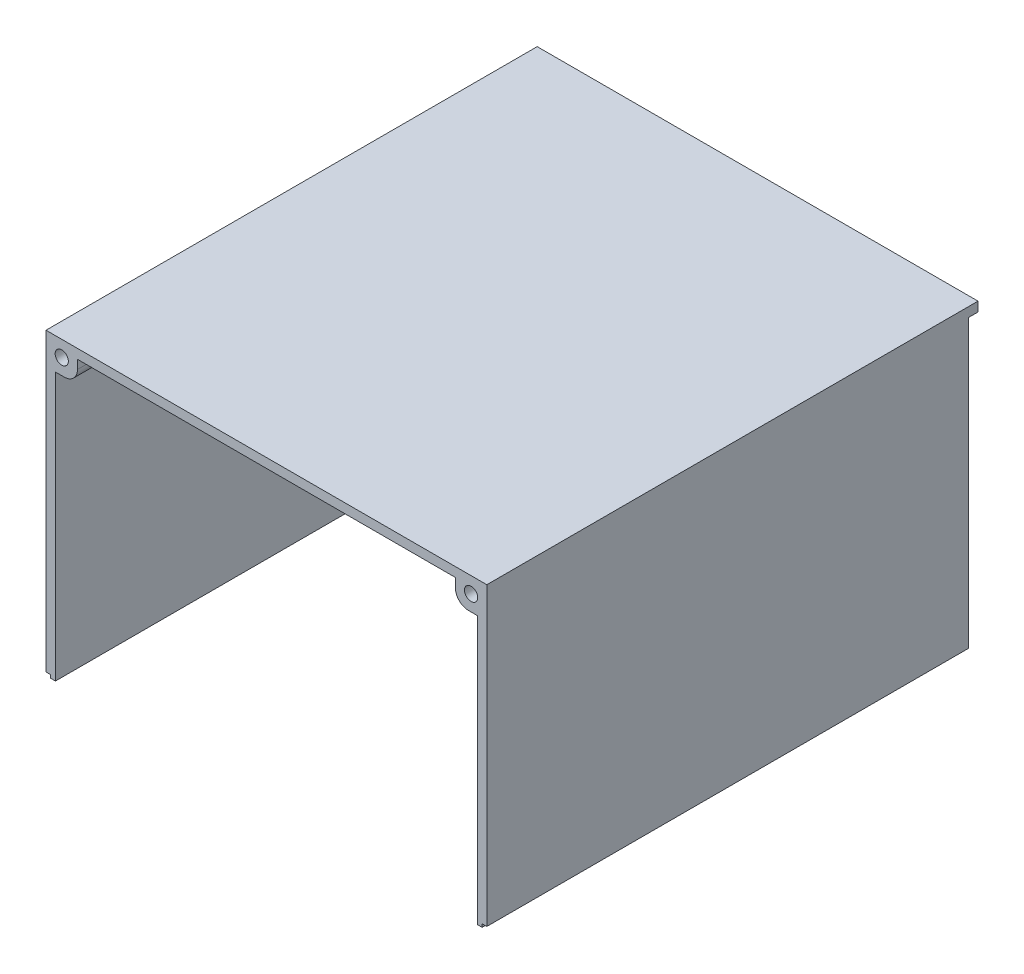
ISO-10303-21;
HEADER;
FILE_DESCRIPTION(('STEP AP214'),'2;1');
FILE_NAME('part.step','',(''),(''),'','','');
FILE_SCHEMA(('AUTOMOTIVE_DESIGN { 1 0 10303 214 1 1 1 1 }'));
ENDSEC;
DATA;
#1=APPLICATION_CONTEXT('core data for automotive mechanical design processes');
#2=APPLICATION_PROTOCOL_DEFINITION('international standard','automotive_design',2000,#1);
#3=PRODUCT_CONTEXT('',#1,'mechanical');
#4=PRODUCT('Part','Part','',(#3));
#5=PRODUCT_RELATED_PRODUCT_CATEGORY('part','',(#4));
#6=PRODUCT_DEFINITION_FORMATION('','',#4);
#7=PRODUCT_DEFINITION_CONTEXT('part definition',#1,'design');
#8=PRODUCT_DEFINITION('design','',#6,#7);
#9=PRODUCT_DEFINITION_SHAPE('','',#8);
#10=(LENGTH_UNIT() NAMED_UNIT(*) SI_UNIT(.MILLI.,.METRE.));
#11=(NAMED_UNIT(*) PLANE_ANGLE_UNIT() SI_UNIT($,.RADIAN.));
#12=(NAMED_UNIT(*) SI_UNIT($,.STERADIAN.) SOLID_ANGLE_UNIT());
#13=UNCERTAINTY_MEASURE_WITH_UNIT(LENGTH_MEASURE(1.E-05),#10,'distance_accuracy_value','');
#14=(GEOMETRIC_REPRESENTATION_CONTEXT(3) GLOBAL_UNCERTAINTY_ASSIGNED_CONTEXT((#13)) GLOBAL_UNIT_ASSIGNED_CONTEXT((#10,
#11,#12)) REPRESENTATION_CONTEXT('',''));
#15=CARTESIAN_POINT('',(0.,0.,0.));
#16=DIRECTION('',(0.,0.,1.));
#17=DIRECTION('',(1.,0.,0.));
#18=AXIS2_PLACEMENT_3D('',#15,#16,#17);
#19=CARTESIAN_POINT('',(0.,0.,0.));
#20=DIRECTION('',(0.,0.,-1.));
#21=DIRECTION('',(-1.,0.,0.));
#22=AXIS2_PLACEMENT_3D('',#19,#20,#21);
#23=PLANE('',#22);
#24=DIRECTION('',(-1.,0.,0.));
#25=VECTOR('',#24,1.);
#26=CARTESIAN_POINT('',(70.,92.,0.));
#27=LINE('',#26,#25);
#28=CARTESIAN_POINT('',(70.,92.,0.));
#29=VERTEX_POINT('',#28);
#30=CARTESIAN_POINT('',(67.0000000000001,92.,0.));
#31=VERTEX_POINT('',#30);
#32=EDGE_CURVE('E298',#29,#31,#27,.T.);
#33=ORIENTED_EDGE('',*,*,#32,.F.);
#34=DIRECTION('',(0.,1.,0.));
#35=VECTOR('',#34,1.);
#36=CARTESIAN_POINT('',(70.,1.00000000000002,0.));
#37=LINE('',#36,#35);
#38=CARTESIAN_POINT('',(70.,1.00000000000002,0.));
#39=VERTEX_POINT('',#38);
#40=EDGE_CURVE('E383',#39,#29,#37,.T.);
#41=ORIENTED_EDGE('',*,*,#40,.F.);
#42=DIRECTION('',(1.,0.,0.));
#43=VECTOR('',#42,1.);
#44=CARTESIAN_POINT('',(68.5,1.00000000000002,0.));
#45=LINE('',#44,#43);
#46=CARTESIAN_POINT('',(68.5,1.00000000000002,0.));
#47=VERTEX_POINT('',#46);
#48=EDGE_CURVE('E381',#47,#39,#45,.T.);
#49=ORIENTED_EDGE('',*,*,#48,.F.);
#50=DIRECTION('',(0.,1.,0.));
#51=VECTOR('',#50,1.);
#52=CARTESIAN_POINT('',(68.5,0.,0.));
#53=LINE('',#52,#51);
#54=CARTESIAN_POINT('',(68.5,0.,0.));
#55=VERTEX_POINT('',#54);
#56=EDGE_CURVE('E379',#55,#47,#53,.T.);
#57=ORIENTED_EDGE('',*,*,#56,.F.);
#58=DIRECTION('',(1.,0.,0.));
#59=VECTOR('',#58,1.);
#60=CARTESIAN_POINT('',(67.,0.,0.));
#61=LINE('',#60,#59);
#62=CARTESIAN_POINT('',(67.,0.,0.));
#63=VERTEX_POINT('',#62);
#64=EDGE_CURVE('E377',#63,#55,#61,.T.);
#65=ORIENTED_EDGE('',*,*,#64,.F.);
#66=DIRECTION('',(0.,-1.,0.));
#67=VECTOR('',#66,1.);
#68=CARTESIAN_POINT('',(67.0000000000001,92.,0.));
#69=LINE('',#68,#67);
#70=EDGE_CURVE('E375',#31,#63,#69,.T.);
#71=ORIENTED_EDGE('',*,*,#70,.F.);
#72=EDGE_LOOP('',(#33,#41,#49,#57,#65,#71));
#73=FACE_BOUND('',#72,.T.);
#74=ADVANCED_FACE('F35',(#73),#23,.T.);
#75=DIRECTION('',(0.,1.,0.));
#76=VECTOR('',#75,1.);
#77=CARTESIAN_POINT('',(67.0000000000001,92.,0.));
#78=LINE('',#77,#76);
#79=CARTESIAN_POINT('',(67.0000000000001,93.,0.));
#80=VERTEX_POINT('',#79);
#81=EDGE_CURVE('E291',#31,#80,#78,.T.);
#82=ORIENTED_EDGE('',*,*,#81,.F.);
#83=DIRECTION('',(1.,0.,0.));
#84=VECTOR('',#83,1.);
#85=CARTESIAN_POINT('',(67.0000000000001,92.,0.));
#86=LINE('',#85,#84);
#87=CARTESIAN_POINT('',(-67.0000000000001,92.,0.));
#88=VERTEX_POINT('',#87);
#89=EDGE_CURVE('E373',#88,#31,#86,.T.);
#90=ORIENTED_EDGE('',*,*,#89,.F.);
#91=DIRECTION('',(0.,-1.,0.));
#92=VECTOR('',#91,1.);
#93=CARTESIAN_POINT('',(-67.0000000000001,93.,0.));
#94=LINE('',#93,#92);
#95=CARTESIAN_POINT('',(-67.0000000000001,93.,0.));
#96=VERTEX_POINT('',#95);
#97=EDGE_CURVE('E310',#96,#88,#94,.T.);
#98=ORIENTED_EDGE('',*,*,#97,.F.);
#99=DIRECTION('',(-1.,0.,0.));
#100=VECTOR('',#99,1.);
#101=CARTESIAN_POINT('',(67.0000000000001,93.,0.));
#102=LINE('',#101,#100);
#103=EDGE_CURVE('E307',#80,#96,#102,.T.);
#104=ORIENTED_EDGE('',*,*,#103,.F.);
#105=EDGE_LOOP('',(#82,#90,#98,#104));
#106=FACE_BOUND('',#105,.T.);
#107=ADVANCED_FACE('F430',(#106),#23,.T.);
#108=CARTESIAN_POINT('',(-68.5,1.00000000000002,153.));
#109=DIRECTION('',(0.,1.,0.));
#110=DIRECTION('',(-1.,0.,0.));
#111=AXIS2_PLACEMENT_3D('',#108,#109,#110);
#112=PLANE('',#111);
#113=DIRECTION('',(1.,0.,0.));
#114=VECTOR('',#113,1.);
#115=CARTESIAN_POINT('',(-68.5,1.00000000000002,0.));
#116=LINE('',#115,#114);
#117=CARTESIAN_POINT('',(-70.,1.00000000000002,0.));
#118=VERTEX_POINT('',#117);
#119=CARTESIAN_POINT('',(-68.5,1.00000000000002,0.));
#120=VERTEX_POINT('',#119);
#121=EDGE_CURVE('E335',#118,#120,#116,.T.);
#122=ORIENTED_EDGE('',*,*,#121,.T.);
#123=DIRECTION('',(0.,0.,-1.));
#124=VECTOR('',#123,1.);
#125=CARTESIAN_POINT('',(-68.5,1.00000000000002,153.));
#126=LINE('',#125,#124);
#127=CARTESIAN_POINT('',(-68.5,1.00000000000002,153.));
#128=VERTEX_POINT('',#127);
#129=EDGE_CURVE('E11',#128,#120,#126,.T.);
#130=ORIENTED_EDGE('',*,*,#129,.F.);
#131=DIRECTION('',(1.,0.,0.));
#132=VECTOR('',#131,1.);
#133=CARTESIAN_POINT('',(-68.5,1.00000000000002,153.));
#134=LINE('',#133,#132);
#135=CARTESIAN_POINT('',(-70.,1.00000000000002,153.));
#136=VERTEX_POINT('',#135);
#137=EDGE_CURVE('E336',#136,#128,#134,.T.);
#138=ORIENTED_EDGE('',*,*,#137,.F.);
#139=DIRECTION('',(0.,0.,-1.));
#140=VECTOR('',#139,1.);
#141=CARTESIAN_POINT('',(-70.,1.00000000000002,153.));
#142=LINE('',#141,#140);
#143=EDGE_CURVE('E363',#136,#118,#142,.T.);
#144=ORIENTED_EDGE('',*,*,#143,.T.);
#145=EDGE_LOOP('',(#122,#130,#138,#144));
#146=FACE_BOUND('',#145,.T.);
#147=ADVANCED_FACE('F37',(#146),#112,.F.);
#148=CARTESIAN_POINT('',(-68.5,0.,153.));
#149=DIRECTION('',(1.,0.,0.));
#150=DIRECTION('',(0.,0.,-1.));
#151=AXIS2_PLACEMENT_3D('',#148,#149,#150);
#152=PLANE('',#151);
#153=DIRECTION('',(0.,-1.,0.));
#154=VECTOR('',#153,1.);
#155=CARTESIAN_POINT('',(-68.5,0.,0.));
#156=LINE('',#155,#154);
#157=CARTESIAN_POINT('',(-68.5,0.,0.));
#158=VERTEX_POINT('',#157);
#159=EDGE_CURVE('E366',#120,#158,#156,.T.);
#160=ORIENTED_EDGE('',*,*,#159,.T.);
#161=DIRECTION('',(0.,0.,-1.));
#162=VECTOR('',#161,1.);
#163=CARTESIAN_POINT('',(-68.5,0.,153.));
#164=LINE('',#163,#162);
#165=CARTESIAN_POINT('',(-68.5,0.,153.));
#166=VERTEX_POINT('',#165);
#167=EDGE_CURVE('E43',#166,#158,#164,.T.);
#168=ORIENTED_EDGE('',*,*,#167,.F.);
#169=DIRECTION('',(0.,-1.,0.));
#170=VECTOR('',#169,1.);
#171=CARTESIAN_POINT('',(-68.5,0.,153.));
#172=LINE('',#171,#170);
#173=EDGE_CURVE('E339',#128,#166,#172,.T.);
#174=ORIENTED_EDGE('',*,*,#173,.F.);
#175=ORIENTED_EDGE('',*,*,#129,.T.);
#176=EDGE_LOOP('',(#160,#168,#174,#175));
#177=FACE_BOUND('',#176,.T.);
#178=ADVANCED_FACE('F495',(#177),#152,.F.);
#179=CARTESIAN_POINT('',(-67.,0.,153.));
#180=DIRECTION('',(0.,1.,0.));
#181=DIRECTION('',(-1.,0.,0.));
#182=AXIS2_PLACEMENT_3D('',#179,#180,#181);
#183=PLANE('',#182);
#184=DIRECTION('',(1.,0.,0.));
#185=VECTOR('',#184,1.);
#186=CARTESIAN_POINT('',(-67.,0.,0.));
#187=LINE('',#186,#185);
#188=CARTESIAN_POINT('',(-67.,0.,0.));
#189=VERTEX_POINT('',#188);
#190=EDGE_CURVE('E368',#158,#189,#187,.T.);
#191=ORIENTED_EDGE('',*,*,#190,.T.);
#192=DIRECTION('',(0.,0.,-1.));
#193=VECTOR('',#192,1.);
#194=CARTESIAN_POINT('',(-67.,0.,153.));
#195=LINE('',#194,#193);
#196=CARTESIAN_POINT('',(-67.,0.,153.));
#197=VERTEX_POINT('',#196);
#198=EDGE_CURVE('E408',#197,#189,#195,.T.);
#199=ORIENTED_EDGE('',*,*,#198,.F.);
#200=DIRECTION('',(1.,0.,0.));
#201=VECTOR('',#200,1.);
#202=CARTESIAN_POINT('',(-67.,0.,153.));
#203=LINE('',#202,#201);
#204=EDGE_CURVE('E342',#166,#197,#203,.T.);
#205=ORIENTED_EDGE('',*,*,#204,.F.);
#206=ORIENTED_EDGE('',*,*,#167,.T.);
#207=EDGE_LOOP('',(#191,#199,#205,#206));
#208=FACE_BOUND('',#207,.T.);
#209=ADVANCED_FACE('F415',(#208),#183,.F.);
#210=CARTESIAN_POINT('',(-67.0000000000001,92.,153.));
#211=DIRECTION('',(-1.,0.,0.));
#212=DIRECTION('',(0.,-1.,0.));
#213=AXIS2_PLACEMENT_3D('',#210,#211,#212);
#214=PLANE('',#213);
#215=DIRECTION('',(0.,-1.,0.));
#216=VECTOR('',#215,1.);
#217=CARTESIAN_POINT('',(-67.0000000000001,92.,145.));
#218=LINE('',#217,#216);
#219=CARTESIAN_POINT('',(-67.0000000000001,92.,145.));
#220=VERTEX_POINT('',#219);
#221=CARTESIAN_POINT('',(-67.0000000000001,85.,145.));
#222=VERTEX_POINT('',#221);
#223=EDGE_CURVE('E250',#220,#222,#218,.T.);
#224=ORIENTED_EDGE('',*,*,#223,.T.);
#225=DIRECTION('',(0.,0.,1.));
#226=VECTOR('',#225,1.);
#227=CARTESIAN_POINT('',(-67.0000000000001,85.,145.));
#228=LINE('',#227,#226);
#229=CARTESIAN_POINT('',(-67.0000000000001,85.,153.));
#230=VERTEX_POINT('',#229);
#231=EDGE_CURVE('E264',#222,#230,#228,.T.);
#232=ORIENTED_EDGE('',*,*,#231,.T.);
#233=DIRECTION('',(0.,1.,0.));
#234=VECTOR('',#233,1.);
#235=CARTESIAN_POINT('',(-67.0000000000001,92.,153.));
#236=LINE('',#235,#234);
#237=EDGE_CURVE('E344',#197,#230,#236,.T.);
#238=ORIENTED_EDGE('',*,*,#237,.F.);
#239=ORIENTED_EDGE('',*,*,#198,.T.);
#240=DIRECTION('',(0.,1.,0.));
#241=VECTOR('',#240,1.);
#242=CARTESIAN_POINT('',(-67.0000000000001,92.,0.));
#243=LINE('',#242,#241);
#244=EDGE_CURVE('E370',#189,#88,#243,.T.);
#245=ORIENTED_EDGE('',*,*,#244,.T.);
#246=DIRECTION('',(0.,0.,-1.));
#247=VECTOR('',#246,1.);
#248=CARTESIAN_POINT('',(-67.0000000000001,92.,153.));
#249=LINE('',#248,#247);
#250=EDGE_CURVE('E406',#220,#88,#249,.T.);
#251=ORIENTED_EDGE('',*,*,#250,.F.);
#252=EDGE_LOOP('',(#224,#232,#238,#239,#245,#251));
#253=FACE_BOUND('',#252,.T.);
#254=ADVANCED_FACE('F426',(#253),#214,.F.);
#255=CARTESIAN_POINT('',(67.0000000000001,92.,153.));
#256=DIRECTION('',(0.,1.,0.));
#257=DIRECTION('',(0.,0.,1.));
#258=AXIS2_PLACEMENT_3D('',#255,#256,#257);
#259=PLANE('',#258);
#260=DIRECTION('',(-1.,0.,0.));
#261=VECTOR('',#260,1.);
#262=CARTESIAN_POINT('',(67.0000000000001,92.,145.));
#263=LINE('',#262,#261);
#264=CARTESIAN_POINT('',(67.0000000000001,92.,145.));
#265=VERTEX_POINT('',#264);
#266=CARTESIAN_POINT('',(60.,92.,145.));
#267=VERTEX_POINT('',#266);
#268=EDGE_CURVE('E220',#265,#267,#263,.T.);
#269=ORIENTED_EDGE('',*,*,#268,.T.);
#270=DIRECTION('',(0.,0.,1.));
#271=VECTOR('',#270,1.);
#272=CARTESIAN_POINT('',(60.,92.,145.));
#273=LINE('',#272,#271);
#274=CARTESIAN_POINT('',(60.,92.,153.));
#275=VERTEX_POINT('',#274);
#276=EDGE_CURVE('E204',#267,#275,#273,.T.);
#277=ORIENTED_EDGE('',*,*,#276,.T.);
#278=DIRECTION('',(1.,0.,0.));
#279=VECTOR('',#278,1.);
#280=CARTESIAN_POINT('',(67.0000000000001,92.,153.));
#281=LINE('',#280,#279);
#282=CARTESIAN_POINT('',(-60.,92.,153.));
#283=VERTEX_POINT('',#282);
#284=EDGE_CURVE('E347',#283,#275,#281,.T.);
#285=ORIENTED_EDGE('',*,*,#284,.F.);
#286=DIRECTION('',(0.,0.,1.));
#287=VECTOR('',#286,1.);
#288=CARTESIAN_POINT('',(-60.,92.,145.));
#289=LINE('',#288,#287);
#290=CARTESIAN_POINT('',(-60.,92.,145.));
#291=VERTEX_POINT('',#290);
#292=EDGE_CURVE('E270',#291,#283,#289,.T.);
#293=ORIENTED_EDGE('',*,*,#292,.F.);
#294=DIRECTION('',(-1.,0.,0.));
#295=VECTOR('',#294,1.);
#296=CARTESIAN_POINT('',(-67.0000000000001,92.,145.));
#297=LINE('',#296,#295);
#298=EDGE_CURVE('E261',#291,#220,#297,.T.);
#299=ORIENTED_EDGE('',*,*,#298,.T.);
#300=ORIENTED_EDGE('',*,*,#250,.T.);
#301=ORIENTED_EDGE('',*,*,#89,.T.);
#302=DIRECTION('',(0.,0.,-1.));
#303=VECTOR('',#302,1.);
#304=CARTESIAN_POINT('',(67.0000000000001,92.,153.));
#305=LINE('',#304,#303);
#306=EDGE_CURVE('E229',#265,#31,#305,.T.);
#307=ORIENTED_EDGE('',*,*,#306,.F.);
#308=EDGE_LOOP('',(#269,#277,#285,#293,#299,#300,#301,#307));
#309=FACE_BOUND('',#308,.T.);
#310=ADVANCED_FACE('F227',(#309),#259,.F.);
#311=CARTESIAN_POINT('',(67.0000000000001,92.,153.));
#312=DIRECTION('',(1.,0.,0.));
#313=DIRECTION('',(0.,1.,0.));
#314=AXIS2_PLACEMENT_3D('',#311,#312,#313);
#315=PLANE('',#314);
#316=DIRECTION('',(0.,-1.,0.));
#317=VECTOR('',#316,1.);
#318=CARTESIAN_POINT('',(67.0000000000001,92.,153.));
#319=LINE('',#318,#317);
#320=CARTESIAN_POINT('',(67.0000000000001,85.,153.));
#321=VERTEX_POINT('',#320);
#322=CARTESIAN_POINT('',(67.,0.,153.));
#323=VERTEX_POINT('',#322);
#324=EDGE_CURVE('E349',#321,#323,#319,.T.);
#325=ORIENTED_EDGE('',*,*,#324,.F.);
#326=DIRECTION('',(0.,0.,1.));
#327=VECTOR('',#326,1.);
#328=CARTESIAN_POINT('',(67.0000000000001,85.,145.));
#329=LINE('',#328,#327);
#330=CARTESIAN_POINT('',(67.0000000000001,85.,145.));
#331=VERTEX_POINT('',#330);
#332=EDGE_CURVE('E244',#331,#321,#329,.T.);
#333=ORIENTED_EDGE('',*,*,#332,.F.);
#334=DIRECTION('',(0.,1.,0.));
#335=VECTOR('',#334,1.);
#336=CARTESIAN_POINT('',(67.0000000000001,92.,145.));
#337=LINE('',#336,#335);
#338=EDGE_CURVE('E214',#331,#265,#337,.T.);
#339=ORIENTED_EDGE('',*,*,#338,.T.);
#340=ORIENTED_EDGE('',*,*,#306,.T.);
#341=ORIENTED_EDGE('',*,*,#70,.T.);
#342=DIRECTION('',(0.,0.,-1.));
#343=VECTOR('',#342,1.);
#344=CARTESIAN_POINT('',(67.,0.,153.));
#345=LINE('',#344,#343);
#346=EDGE_CURVE('E402',#323,#63,#345,.T.);
#347=ORIENTED_EDGE('',*,*,#346,.F.);
#348=EDGE_LOOP('',(#325,#333,#339,#340,#341,#347));
#349=FACE_BOUND('',#348,.T.);
#350=ADVANCED_FACE('F485',(#349),#315,.F.);
#351=CARTESIAN_POINT('',(67.,0.,153.));
#352=DIRECTION('',(0.,1.,0.));
#353=DIRECTION('',(-1.,0.,0.));
#354=AXIS2_PLACEMENT_3D('',#351,#352,#353);
#355=PLANE('',#354);
#356=ORIENTED_EDGE('',*,*,#64,.T.);
#357=DIRECTION('',(0.,0.,-1.));
#358=VECTOR('',#357,1.);
#359=CARTESIAN_POINT('',(68.5,0.,153.));
#360=LINE('',#359,#358);
#361=CARTESIAN_POINT('',(68.5,0.,153.));
#362=VERTEX_POINT('',#361);
#363=EDGE_CURVE('E399',#362,#55,#360,.T.);
#364=ORIENTED_EDGE('',*,*,#363,.F.);
#365=DIRECTION('',(1.,0.,0.));
#366=VECTOR('',#365,1.);
#367=CARTESIAN_POINT('',(67.,0.,153.));
#368=LINE('',#367,#366);
#369=EDGE_CURVE('E351',#323,#362,#368,.T.);
#370=ORIENTED_EDGE('',*,*,#369,.F.);
#371=ORIENTED_EDGE('',*,*,#346,.T.);
#372=EDGE_LOOP('',(#356,#364,#370,#371));
#373=FACE_BOUND('',#372,.T.);
#374=ADVANCED_FACE('F481',(#373),#355,.F.);
#375=CARTESIAN_POINT('',(68.5,0.,153.));
#376=DIRECTION('',(-1.,0.,0.));
#377=DIRECTION('',(0.,0.,1.));
#378=AXIS2_PLACEMENT_3D('',#375,#376,#377);
#379=PLANE('',#378);
#380=ORIENTED_EDGE('',*,*,#56,.T.);
#381=DIRECTION('',(0.,0.,-1.));
#382=VECTOR('',#381,1.);
#383=CARTESIAN_POINT('',(68.5,1.00000000000002,153.));
#384=LINE('',#383,#382);
#385=CARTESIAN_POINT('',(68.5,1.00000000000002,153.));
#386=VERTEX_POINT('',#385);
#387=EDGE_CURVE('E396',#386,#47,#384,.T.);
#388=ORIENTED_EDGE('',*,*,#387,.F.);
#389=DIRECTION('',(0.,1.,0.));
#390=VECTOR('',#389,1.);
#391=CARTESIAN_POINT('',(68.5,0.,153.));
#392=LINE('',#391,#390);
#393=EDGE_CURVE('E353',#362,#386,#392,.T.);
#394=ORIENTED_EDGE('',*,*,#393,.F.);
#395=ORIENTED_EDGE('',*,*,#363,.T.);
#396=EDGE_LOOP('',(#380,#388,#394,#395));
#397=FACE_BOUND('',#396,.T.);
#398=ADVANCED_FACE('F477',(#397),#379,.F.);
#399=CARTESIAN_POINT('',(68.5,1.00000000000002,153.));
#400=DIRECTION('',(0.,1.,0.));
#401=DIRECTION('',(-1.,0.,0.));
#402=AXIS2_PLACEMENT_3D('',#399,#400,#401);
#403=PLANE('',#402);
#404=ORIENTED_EDGE('',*,*,#48,.T.);
#405=DIRECTION('',(0.,0.,-1.));
#406=VECTOR('',#405,1.);
#407=CARTESIAN_POINT('',(70.,1.00000000000002,153.));
#408=LINE('',#407,#406);
#409=CARTESIAN_POINT('',(70.,1.00000000000002,153.));
#410=VERTEX_POINT('',#409);
#411=EDGE_CURVE('E393',#410,#39,#408,.T.);
#412=ORIENTED_EDGE('',*,*,#411,.F.);
#413=DIRECTION('',(1.,0.,0.));
#414=VECTOR('',#413,1.);
#415=CARTESIAN_POINT('',(68.5,1.00000000000002,153.));
#416=LINE('',#415,#414);
#417=EDGE_CURVE('E355',#386,#410,#416,.T.);
#418=ORIENTED_EDGE('',*,*,#417,.F.);
#419=ORIENTED_EDGE('',*,*,#387,.T.);
#420=EDGE_LOOP('',(#404,#412,#418,#419));
#421=FACE_BOUND('',#420,.T.);
#422=ADVANCED_FACE('F473',(#421),#403,.F.);
#423=CARTESIAN_POINT('',(70.,1.00000000000002,153.));
#424=DIRECTION('',(-1.,0.,0.));
#425=DIRECTION('',(0.,-1.,0.));
#426=AXIS2_PLACEMENT_3D('',#423,#424,#425);
#427=PLANE('',#426);
#428=ORIENTED_EDGE('',*,*,#40,.T.);
#429=DIRECTION('',(0.,0.,1.));
#430=VECTOR('',#429,1.);
#431=CARTESIAN_POINT('',(70.,92.,-1.5));
#432=LINE('',#431,#430);
#433=CARTESIAN_POINT('',(70.,92.,-3.));
#434=VERTEX_POINT('',#433);
#435=EDGE_CURVE('E320',#434,#29,#432,.T.);
#436=ORIENTED_EDGE('',*,*,#435,.F.);
#437=DIRECTION('',(0.,-1.,0.));
#438=VECTOR('',#437,1.);
#439=CARTESIAN_POINT('',(70.,92.,-3.));
#440=LINE('',#439,#438);
#441=CARTESIAN_POINT('',(70.,95.,-3.));
#442=VERTEX_POINT('',#441);
#443=EDGE_CURVE('E279',#442,#434,#440,.T.);
#444=ORIENTED_EDGE('',*,*,#443,.F.);
#445=DIRECTION('',(0.,0.,-1.));
#446=VECTOR('',#445,1.);
#447=CARTESIAN_POINT('',(70.,95.,153.));
#448=LINE('',#447,#446);
#449=CARTESIAN_POINT('',(70.,95.,153.));
#450=VERTEX_POINT('',#449);
#451=EDGE_CURVE('E391',#450,#442,#448,.T.);
#452=ORIENTED_EDGE('',*,*,#451,.F.);
#453=DIRECTION('',(0.,1.,0.));
#454=VECTOR('',#453,1.);
#455=CARTESIAN_POINT('',(70.,1.00000000000002,153.));
#456=LINE('',#455,#454);
#457=EDGE_CURVE('E357',#410,#450,#456,.T.);
#458=ORIENTED_EDGE('',*,*,#457,.F.);
#459=ORIENTED_EDGE('',*,*,#411,.T.);
#460=EDGE_LOOP('',(#428,#436,#444,#452,#458,#459));
#461=FACE_BOUND('',#460,.T.);
#462=ADVANCED_FACE('F469',(#461),#427,.F.);
#463=CARTESIAN_POINT('',(-70.,95.,153.));
#464=DIRECTION('',(0.,-1.,0.));
#465=DIRECTION('',(0.,0.,-1.));
#466=AXIS2_PLACEMENT_3D('',#463,#464,#465);
#467=PLANE('',#466);
#468=ORIENTED_EDGE('',*,*,#451,.T.);
#469=DIRECTION('',(1.,0.,0.));
#470=VECTOR('',#469,1.);
#471=CARTESIAN_POINT('',(70.,95.,-3.));
#472=LINE('',#471,#470);
#473=CARTESIAN_POINT('',(-70.,95.,-3.));
#474=VERTEX_POINT('',#473);
#475=EDGE_CURVE('E288',#474,#442,#472,.T.);
#476=ORIENTED_EDGE('',*,*,#475,.F.);
#477=DIRECTION('',(0.,0.,-1.));
#478=VECTOR('',#477,1.);
#479=CARTESIAN_POINT('',(-70.,95.,153.));
#480=LINE('',#479,#478);
#481=CARTESIAN_POINT('',(-70.,95.,153.));
#482=VERTEX_POINT('',#481);
#483=EDGE_CURVE('E389',#482,#474,#480,.T.);
#484=ORIENTED_EDGE('',*,*,#483,.F.);
#485=DIRECTION('',(-1.,0.,0.));
#486=VECTOR('',#485,1.);
#487=CARTESIAN_POINT('',(-70.,95.,153.));
#488=LINE('',#487,#486);
#489=EDGE_CURVE('E359',#450,#482,#488,.T.);
#490=ORIENTED_EDGE('',*,*,#489,.F.);
#491=EDGE_LOOP('',(#468,#476,#484,#490));
#492=FACE_BOUND('',#491,.T.);
#493=ADVANCED_FACE('F465',(#492),#467,.F.);
#494=CARTESIAN_POINT('',(-70.,1.00000000000002,153.));
#495=DIRECTION('',(1.,0.,0.));
#496=DIRECTION('',(0.,1.,0.));
#497=AXIS2_PLACEMENT_3D('',#494,#495,#496);
#498=PLANE('',#497);
#499=ORIENTED_EDGE('',*,*,#483,.T.);
#500=DIRECTION('',(0.,1.,0.));
#501=VECTOR('',#500,1.);
#502=CARTESIAN_POINT('',(-70.,92.,-3.));
#503=LINE('',#502,#501);
#504=CARTESIAN_POINT('',(-70.,92.,-3.));
#505=VERTEX_POINT('',#504);
#506=EDGE_CURVE('E285',#505,#474,#503,.T.);
#507=ORIENTED_EDGE('',*,*,#506,.F.);
#508=DIRECTION('',(0.,0.,1.));
#509=VECTOR('',#508,1.);
#510=CARTESIAN_POINT('',(-70.,92.,-1.5));
#511=LINE('',#510,#509);
#512=CARTESIAN_POINT('',(-70.,92.,0.));
#513=VERTEX_POINT('',#512);
#514=EDGE_CURVE('E323',#505,#513,#511,.T.);
#515=ORIENTED_EDGE('',*,*,#514,.T.);
#516=DIRECTION('',(0.,-1.,0.));
#517=VECTOR('',#516,1.);
#518=CARTESIAN_POINT('',(-70.,1.00000000000002,0.));
#519=LINE('',#518,#517);
#520=EDGE_CURVE('E340',#513,#118,#519,.T.);
#521=ORIENTED_EDGE('',*,*,#520,.T.);
#522=ORIENTED_EDGE('',*,*,#143,.F.);
#523=DIRECTION('',(0.,-1.,0.));
#524=VECTOR('',#523,1.);
#525=CARTESIAN_POINT('',(-70.,1.00000000000002,153.));
#526=LINE('',#525,#524);
#527=EDGE_CURVE('E361',#482,#136,#526,.T.);
#528=ORIENTED_EDGE('',*,*,#527,.F.);
#529=EDGE_LOOP('',(#499,#507,#515,#521,#522,#528));
#530=FACE_BOUND('',#529,.T.);
#531=ADVANCED_FACE('F462',(#530),#498,.F.);
#532=CARTESIAN_POINT('',(0.,0.,153.));
#533=DIRECTION('',(0.,0.,-1.));
#534=DIRECTION('',(-1.,0.,0.));
#535=AXIS2_PLACEMENT_3D('',#532,#533,#534);
#536=PLANE('',#535);
#537=CARTESIAN_POINT('',(-65.,90.,153.));
#538=DIRECTION('',(0.,0.,1.));
#539=DIRECTION('',(1.,0.,0.));
#540=AXIS2_PLACEMENT_3D('',#537,#538,#539);
#541=CIRCLE('',#540,2.1);
#542=CARTESIAN_POINT('',(-62.9,90.,153.));
#543=VERTEX_POINT('',#542);
#544=EDGE_CURVE('E687',#543,#543,#541,.T.);
#545=ORIENTED_EDGE('',*,*,#544,.F.);
#546=EDGE_LOOP('',(#545));
#547=FACE_BOUND('',#546,.T.);
#548=CARTESIAN_POINT('',(65.,90.,153.));
#549=DIRECTION('',(0.,0.,1.));
#550=DIRECTION('',(-1.,0.,0.));
#551=AXIS2_PLACEMENT_3D('',#548,#549,#550);
#552=CIRCLE('',#551,2.1);
#553=CARTESIAN_POINT('',(62.9,90.,153.));
#554=VERTEX_POINT('',#553);
#555=EDGE_CURVE('E234',#554,#554,#552,.T.);
#556=ORIENTED_EDGE('',*,*,#555,.F.);
#557=EDGE_LOOP('',(#556));
#558=FACE_BOUND('',#557,.T.);
#559=ORIENTED_EDGE('',*,*,#284,.T.);
#560=DIRECTION('',(0.,-1.,0.));
#561=VECTOR('',#560,1.);
#562=CARTESIAN_POINT('',(60.,92.,153.));
#563=LINE('',#562,#561);
#564=CARTESIAN_POINT('',(60.,89.2,153.));
#565=VERTEX_POINT('',#564);
#566=EDGE_CURVE('E209',#275,#565,#563,.T.);
#567=ORIENTED_EDGE('',*,*,#566,.T.);
#568=CARTESIAN_POINT('',(64.2,89.2,153.));
#569=DIRECTION('',(0.,0.,1.));
#570=DIRECTION('',(1.,0.,0.));
#571=AXIS2_PLACEMENT_3D('',#568,#569,#570);
#572=CIRCLE('',#571,4.2);
#573=CARTESIAN_POINT('',(64.2,85.,153.));
#574=VERTEX_POINT('',#573);
#575=EDGE_CURVE('E231',#565,#574,#572,.T.);
#576=ORIENTED_EDGE('',*,*,#575,.T.);
#577=DIRECTION('',(1.,0.,0.));
#578=VECTOR('',#577,1.);
#579=CARTESIAN_POINT('',(67.0000000000001,85.,153.));
#580=LINE('',#579,#578);
#581=EDGE_CURVE('E50',#574,#321,#580,.T.);
#582=ORIENTED_EDGE('',*,*,#581,.T.);
#583=ORIENTED_EDGE('',*,*,#324,.T.);
#584=ORIENTED_EDGE('',*,*,#369,.T.);
#585=ORIENTED_EDGE('',*,*,#393,.T.);
#586=ORIENTED_EDGE('',*,*,#417,.T.);
#587=ORIENTED_EDGE('',*,*,#457,.T.);
#588=ORIENTED_EDGE('',*,*,#489,.T.);
#589=ORIENTED_EDGE('',*,*,#527,.T.);
#590=ORIENTED_EDGE('',*,*,#137,.T.);
#591=ORIENTED_EDGE('',*,*,#173,.T.);
#592=ORIENTED_EDGE('',*,*,#204,.T.);
#593=ORIENTED_EDGE('',*,*,#237,.T.);
#594=DIRECTION('',(1.,0.,0.));
#595=VECTOR('',#594,1.);
#596=CARTESIAN_POINT('',(-67.0000000000001,85.,153.));
#597=LINE('',#596,#595);
#598=CARTESIAN_POINT('',(-64.2,85.,153.));
#599=VERTEX_POINT('',#598);
#600=EDGE_CURVE('E246',#230,#599,#597,.T.);
#601=ORIENTED_EDGE('',*,*,#600,.T.);
#602=CARTESIAN_POINT('',(-64.2,89.2,153.));
#603=DIRECTION('',(0.,0.,1.));
#604=DIRECTION('',(1.,0.,0.));
#605=AXIS2_PLACEMENT_3D('',#602,#603,#604);
#606=CIRCLE('',#605,4.2);
#607=CARTESIAN_POINT('',(-60.,89.2,153.));
#608=VERTEX_POINT('',#607);
#609=EDGE_CURVE('E267',#599,#608,#606,.T.);
#610=ORIENTED_EDGE('',*,*,#609,.T.);
#611=DIRECTION('',(0.,1.,0.));
#612=VECTOR('',#611,1.);
#613=CARTESIAN_POINT('',(-60.,92.,153.));
#614=LINE('',#613,#612);
#615=EDGE_CURVE('E57',#608,#283,#614,.T.);
#616=ORIENTED_EDGE('',*,*,#615,.T.);
#617=EDGE_LOOP('',(#559,#567,#576,#582,#583,#584,#585,#586,#587,#588,#589,#590,#591,#592,#593,
#601,#610,#616));
#618=FACE_BOUND('',#617,.T.);
#619=ADVANCED_FACE('F453',(#547,#558,#618),#536,.F.);
#620=DIRECTION('',(-1.,0.,0.));
#621=VECTOR('',#620,1.);
#622=CARTESIAN_POINT('',(-67.0000000000001,92.,0.));
#623=LINE('',#622,#621);
#624=EDGE_CURVE('E313',#88,#513,#623,.T.);
#625=ORIENTED_EDGE('',*,*,#624,.F.);
#626=ORIENTED_EDGE('',*,*,#244,.F.);
#627=ORIENTED_EDGE('',*,*,#190,.F.);
#628=ORIENTED_EDGE('',*,*,#159,.F.);
#629=ORIENTED_EDGE('',*,*,#121,.F.);
#630=ORIENTED_EDGE('',*,*,#520,.F.);
#631=EDGE_LOOP('',(#625,#626,#627,#628,#629,#630));
#632=FACE_BOUND('',#631,.T.);
#633=ADVANCED_FACE('F421',(#632),#23,.T.);
#634=CARTESIAN_POINT('',(67.0000000000001,92.,-1.5));
#635=DIRECTION('',(1.,0.,0.));
#636=DIRECTION('',(0.,0.,-1.));
#637=AXIS2_PLACEMENT_3D('',#634,#635,#636);
#638=PLANE('',#637);
#639=ORIENTED_EDGE('',*,*,#81,.T.);
#640=DIRECTION('',(0.,0.,1.));
#641=VECTOR('',#640,1.);
#642=CARTESIAN_POINT('',(67.0000000000001,93.,-1.5));
#643=LINE('',#642,#641);
#644=CARTESIAN_POINT('',(67.0000000000001,93.,-1.5));
#645=VERTEX_POINT('',#644);
#646=EDGE_CURVE('E332',#645,#80,#643,.T.);
#647=ORIENTED_EDGE('',*,*,#646,.F.);
#648=DIRECTION('',(0.,1.,0.));
#649=VECTOR('',#648,1.);
#650=CARTESIAN_POINT('',(67.0000000000001,92.,-1.5));
#651=LINE('',#650,#649);
#652=CARTESIAN_POINT('',(67.0000000000001,92.,-1.5));
#653=VERTEX_POINT('',#652);
#654=EDGE_CURVE('E294',#653,#645,#651,.T.);
#655=ORIENTED_EDGE('',*,*,#654,.F.);
#656=DIRECTION('',(0.,0.,1.));
#657=VECTOR('',#656,1.);
#658=CARTESIAN_POINT('',(67.0000000000001,92.,-1.5));
#659=LINE('',#658,#657);
#660=EDGE_CURVE('E304',#653,#31,#659,.T.);
#661=ORIENTED_EDGE('',*,*,#660,.T.);
#662=EDGE_LOOP('',(#639,#647,#655,#661));
#663=FACE_BOUND('',#662,.T.);
#664=ADVANCED_FACE('F445',(#663),#638,.F.);
#665=CARTESIAN_POINT('',(67.0000000000001,93.,-1.5));
#666=DIRECTION('',(0.,1.,0.));
#667=DIRECTION('',(0.,0.,1.));
#668=AXIS2_PLACEMENT_3D('',#665,#666,#667);
#669=PLANE('',#668);
#670=ORIENTED_EDGE('',*,*,#103,.T.);
#671=DIRECTION('',(0.,0.,1.));
#672=VECTOR('',#671,1.);
#673=CARTESIAN_POINT('',(-67.0000000000001,93.,-1.5));
#674=LINE('',#673,#672);
#675=CARTESIAN_POINT('',(-67.0000000000001,93.,-1.5));
#676=VERTEX_POINT('',#675);
#677=EDGE_CURVE('E329',#676,#96,#674,.T.);
#678=ORIENTED_EDGE('',*,*,#677,.F.);
#679=DIRECTION('',(-1.,0.,0.));
#680=VECTOR('',#679,1.);
#681=CARTESIAN_POINT('',(67.0000000000001,93.,-1.5));
#682=LINE('',#681,#680);
#683=EDGE_CURVE('E297',#645,#676,#682,.T.);
#684=ORIENTED_EDGE('',*,*,#683,.F.);
#685=ORIENTED_EDGE('',*,*,#646,.T.);
#686=EDGE_LOOP('',(#670,#678,#684,#685));
#687=FACE_BOUND('',#686,.T.);
#688=ADVANCED_FACE('F443',(#687),#669,.F.);
#689=CARTESIAN_POINT('',(-67.0000000000001,93.,-1.5));
#690=DIRECTION('',(-1.,0.,0.));
#691=DIRECTION('',(0.,0.,1.));
#692=AXIS2_PLACEMENT_3D('',#689,#690,#691);
#693=PLANE('',#692);
#694=ORIENTED_EDGE('',*,*,#97,.T.);
#695=DIRECTION('',(0.,0.,1.));
#696=VECTOR('',#695,1.);
#697=CARTESIAN_POINT('',(-67.0000000000001,92.,-1.5));
#698=LINE('',#697,#696);
#699=CARTESIAN_POINT('',(-67.0000000000001,92.,-1.5));
#700=VERTEX_POINT('',#699);
#701=EDGE_CURVE('E326',#700,#88,#698,.T.);
#702=ORIENTED_EDGE('',*,*,#701,.F.);
#703=DIRECTION('',(0.,-1.,0.));
#704=VECTOR('',#703,1.);
#705=CARTESIAN_POINT('',(-67.0000000000001,93.,-1.5));
#706=LINE('',#705,#704);
#707=EDGE_CURVE('E301',#676,#700,#706,.T.);
#708=ORIENTED_EDGE('',*,*,#707,.F.);
#709=ORIENTED_EDGE('',*,*,#677,.T.);
#710=EDGE_LOOP('',(#694,#702,#708,#709));
#711=FACE_BOUND('',#710,.T.);
#712=ADVANCED_FACE('F433',(#711),#693,.F.);
#713=CARTESIAN_POINT('',(-67.0000000000001,92.,-1.5));
#714=DIRECTION('',(0.,1.,0.));
#715=DIRECTION('',(0.,0.,1.));
#716=AXIS2_PLACEMENT_3D('',#713,#714,#715);
#717=PLANE('',#716);
#718=ORIENTED_EDGE('',*,*,#624,.T.);
#719=ORIENTED_EDGE('',*,*,#514,.F.);
#720=DIRECTION('',(-1.,0.,0.));
#721=VECTOR('',#720,1.);
#722=CARTESIAN_POINT('',(70.,92.,-3.));
#723=LINE('',#722,#721);
#724=EDGE_CURVE('E282',#434,#505,#723,.T.);
#725=ORIENTED_EDGE('',*,*,#724,.F.);
#726=ORIENTED_EDGE('',*,*,#435,.T.);
#727=ORIENTED_EDGE('',*,*,#32,.T.);
#728=ORIENTED_EDGE('',*,*,#660,.F.);
#729=DIRECTION('',(-1.,0.,0.));
#730=VECTOR('',#729,1.);
#731=CARTESIAN_POINT('',(70.,92.,-1.5));
#732=LINE('',#731,#730);
#733=EDGE_CURVE('E272',#653,#700,#732,.T.);
#734=ORIENTED_EDGE('',*,*,#733,.T.);
#735=ORIENTED_EDGE('',*,*,#701,.T.);
#736=EDGE_LOOP('',(#718,#719,#725,#726,#727,#728,#734,#735));
#737=FACE_BOUND('',#736,.T.);
#738=ADVANCED_FACE('F436',(#737),#717,.F.);
#739=CARTESIAN_POINT('',(0.,0.,-3.));
#740=DIRECTION('',(0.,0.,1.));
#741=DIRECTION('',(1.,0.,0.));
#742=AXIS2_PLACEMENT_3D('',#739,#740,#741);
#743=PLANE('',#742);
#744=ORIENTED_EDGE('',*,*,#443,.T.);
#745=ORIENTED_EDGE('',*,*,#724,.T.);
#746=ORIENTED_EDGE('',*,*,#506,.T.);
#747=ORIENTED_EDGE('',*,*,#475,.T.);
#748=EDGE_LOOP('',(#744,#745,#746,#747));
#749=FACE_BOUND('',#748,.T.);
#750=ADVANCED_FACE('F508',(#749),#743,.F.);
#751=CARTESIAN_POINT('',(0.,0.,-1.5));
#752=DIRECTION('',(0.,0.,1.));
#753=DIRECTION('',(1.,0.,0.));
#754=AXIS2_PLACEMENT_3D('',#751,#752,#753);
#755=PLANE('',#754);
#756=ORIENTED_EDGE('',*,*,#733,.F.);
#757=ORIENTED_EDGE('',*,*,#654,.T.);
#758=ORIENTED_EDGE('',*,*,#683,.T.);
#759=ORIENTED_EDGE('',*,*,#707,.T.);
#760=EDGE_LOOP('',(#756,#757,#758,#759));
#761=FACE_BOUND('',#760,.T.);
#762=ADVANCED_FACE('F440',(#761),#755,.T.);
#763=CARTESIAN_POINT('',(-60.,92.,145.));
#764=DIRECTION('',(1.,0.,0.));
#765=DIRECTION('',(0.,0.,-1.));
#766=AXIS2_PLACEMENT_3D('',#763,#764,#765);
#767=PLANE('',#766);
#768=ORIENTED_EDGE('',*,*,#615,.F.);
#769=DIRECTION('',(0.,0.,1.));
#770=VECTOR('',#769,1.);
#771=CARTESIAN_POINT('',(-60.,89.2,145.));
#772=LINE('',#771,#770);
#773=CARTESIAN_POINT('',(-60.,89.2,145.));
#774=VERTEX_POINT('',#773);
#775=EDGE_CURVE('E273',#774,#608,#772,.T.);
#776=ORIENTED_EDGE('',*,*,#775,.F.);
#777=DIRECTION('',(0.,1.,0.));
#778=VECTOR('',#777,1.);
#779=CARTESIAN_POINT('',(-60.,92.,145.));
#780=LINE('',#779,#778);
#781=EDGE_CURVE('E259',#774,#291,#780,.T.);
#782=ORIENTED_EDGE('',*,*,#781,.T.);
#783=ORIENTED_EDGE('',*,*,#292,.T.);
#784=EDGE_LOOP('',(#768,#776,#782,#783));
#785=FACE_BOUND('',#784,.T.);
#786=ADVANCED_FACE('F533',(#785),#767,.T.);
#787=CARTESIAN_POINT('',(-64.2,89.2,145.));
#788=DIRECTION('',(0.,0.,1.));
#789=DIRECTION('',(1.,0.,0.));
#790=AXIS2_PLACEMENT_3D('',#787,#788,#789);
#791=CYLINDRICAL_SURFACE('',#790,4.2);
#792=ORIENTED_EDGE('',*,*,#609,.F.);
#793=DIRECTION('',(0.,0.,1.));
#794=VECTOR('',#793,1.);
#795=CARTESIAN_POINT('',(-64.2,85.,145.));
#796=LINE('',#795,#794);
#797=CARTESIAN_POINT('',(-64.2,85.,145.));
#798=VERTEX_POINT('',#797);
#799=EDGE_CURVE('E275',#798,#599,#796,.T.);
#800=ORIENTED_EDGE('',*,*,#799,.F.);
#801=CARTESIAN_POINT('',(-64.2,89.2,145.));
#802=DIRECTION('',(0.,0.,1.));
#803=DIRECTION('',(1.,0.,0.));
#804=AXIS2_PLACEMENT_3D('',#801,#802,#803);
#805=CIRCLE('',#804,4.2);
#806=EDGE_CURVE('E256',#798,#774,#805,.T.);
#807=ORIENTED_EDGE('',*,*,#806,.T.);
#808=ORIENTED_EDGE('',*,*,#775,.T.);
#809=EDGE_LOOP('',(#792,#800,#807,#808));
#810=FACE_BOUND('',#809,.T.);
#811=ADVANCED_FACE('F546',(#810),#791,.T.);
#812=CARTESIAN_POINT('',(-67.0000000000001,85.,145.));
#813=DIRECTION('',(0.,-1.,0.));
#814=DIRECTION('',(0.,0.,-1.));
#815=AXIS2_PLACEMENT_3D('',#812,#813,#814);
#816=PLANE('',#815);
#817=ORIENTED_EDGE('',*,*,#600,.F.);
#818=ORIENTED_EDGE('',*,*,#231,.F.);
#819=DIRECTION('',(1.,0.,0.));
#820=VECTOR('',#819,1.);
#821=CARTESIAN_POINT('',(-67.0000000000001,85.,145.));
#822=LINE('',#821,#820);
#823=EDGE_CURVE('E253',#222,#798,#822,.T.);
#824=ORIENTED_EDGE('',*,*,#823,.T.);
#825=ORIENTED_EDGE('',*,*,#799,.T.);
#826=EDGE_LOOP('',(#817,#818,#824,#825));
#827=FACE_BOUND('',#826,.T.);
#828=ADVANCED_FACE('F544',(#827),#816,.T.);
#829=CARTESIAN_POINT('',(-64.2,89.2,145.));
#830=DIRECTION('',(0.,0.,1.));
#831=DIRECTION('',(1.,0.,0.));
#832=AXIS2_PLACEMENT_3D('',#829,#830,#831);
#833=PLANE('',#832);
#834=ORIENTED_EDGE('',*,*,#223,.F.);
#835=ORIENTED_EDGE('',*,*,#298,.F.);
#836=ORIENTED_EDGE('',*,*,#781,.F.);
#837=ORIENTED_EDGE('',*,*,#806,.F.);
#838=ORIENTED_EDGE('',*,*,#823,.F.);
#839=EDGE_LOOP('',(#834,#835,#836,#837,#838));
#840=FACE_BOUND('',#839,.T.);
#841=ADVANCED_FACE('F537',(#840),#833,.F.);
#842=CARTESIAN_POINT('',(67.0000000000001,85.,145.));
#843=DIRECTION('',(0.,-1.,0.));
#844=DIRECTION('',(0.,0.,-1.));
#845=AXIS2_PLACEMENT_3D('',#842,#843,#844);
#846=PLANE('',#845);
#847=ORIENTED_EDGE('',*,*,#581,.F.);
#848=DIRECTION('',(0.,0.,1.));
#849=VECTOR('',#848,1.);
#850=CARTESIAN_POINT('',(64.2,85.,145.));
#851=LINE('',#850,#849);
#852=CARTESIAN_POINT('',(64.2,85.,145.));
#853=VERTEX_POINT('',#852);
#854=EDGE_CURVE('E247',#853,#574,#851,.T.);
#855=ORIENTED_EDGE('',*,*,#854,.F.);
#856=DIRECTION('',(1.,0.,0.));
#857=VECTOR('',#856,1.);
#858=CARTESIAN_POINT('',(67.0000000000001,85.,145.));
#859=LINE('',#858,#857);
#860=EDGE_CURVE('E238',#853,#331,#859,.T.);
#861=ORIENTED_EDGE('',*,*,#860,.T.);
#862=ORIENTED_EDGE('',*,*,#332,.T.);
#863=EDGE_LOOP('',(#847,#855,#861,#862));
#864=FACE_BOUND('',#863,.T.);
#865=ADVANCED_FACE('F526',(#864),#846,.T.);
#866=CARTESIAN_POINT('',(64.2,89.2,145.));
#867=DIRECTION('',(0.,0.,1.));
#868=DIRECTION('',(1.,0.,0.));
#869=AXIS2_PLACEMENT_3D('',#866,#867,#868);
#870=CYLINDRICAL_SURFACE('',#869,4.2);
#871=ORIENTED_EDGE('',*,*,#575,.F.);
#872=DIRECTION('',(0.,0.,1.));
#873=VECTOR('',#872,1.);
#874=CARTESIAN_POINT('',(60.,89.2,145.));
#875=LINE('',#874,#873);
#876=CARTESIAN_POINT('',(60.,89.2,145.));
#877=VERTEX_POINT('',#876);
#878=EDGE_CURVE('E213',#877,#565,#875,.T.);
#879=ORIENTED_EDGE('',*,*,#878,.F.);
#880=CARTESIAN_POINT('',(64.2,89.2,145.));
#881=DIRECTION('',(0.,0.,1.));
#882=DIRECTION('',(1.,0.,0.));
#883=AXIS2_PLACEMENT_3D('',#880,#881,#882);
#884=CIRCLE('',#883,4.2);
#885=EDGE_CURVE('E224',#877,#853,#884,.T.);
#886=ORIENTED_EDGE('',*,*,#885,.T.);
#887=ORIENTED_EDGE('',*,*,#854,.T.);
#888=EDGE_LOOP('',(#871,#879,#886,#887));
#889=FACE_BOUND('',#888,.T.);
#890=ADVANCED_FACE('F529',(#889),#870,.T.);
#891=CARTESIAN_POINT('',(60.,92.,145.));
#892=DIRECTION('',(-1.,0.,0.));
#893=DIRECTION('',(0.,0.,1.));
#894=AXIS2_PLACEMENT_3D('',#891,#892,#893);
#895=PLANE('',#894);
#896=ORIENTED_EDGE('',*,*,#566,.F.);
#897=ORIENTED_EDGE('',*,*,#276,.F.);
#898=DIRECTION('',(0.,-1.,0.));
#899=VECTOR('',#898,1.);
#900=CARTESIAN_POINT('',(60.,92.,145.));
#901=LINE('',#900,#899);
#902=EDGE_CURVE('E207',#267,#877,#901,.T.);
#903=ORIENTED_EDGE('',*,*,#902,.T.);
#904=ORIENTED_EDGE('',*,*,#878,.T.);
#905=EDGE_LOOP('',(#896,#897,#903,#904));
#906=FACE_BOUND('',#905,.T.);
#907=ADVANCED_FACE('F206',(#906),#895,.T.);
#908=CARTESIAN_POINT('',(64.2,89.2,145.));
#909=DIRECTION('',(0.,0.,1.));
#910=DIRECTION('',(1.,0.,0.));
#911=AXIS2_PLACEMENT_3D('',#908,#909,#910);
#912=PLANE('',#911);
#913=ORIENTED_EDGE('',*,*,#268,.F.);
#914=ORIENTED_EDGE('',*,*,#338,.F.);
#915=ORIENTED_EDGE('',*,*,#860,.F.);
#916=ORIENTED_EDGE('',*,*,#885,.F.);
#917=ORIENTED_EDGE('',*,*,#902,.F.);
#918=EDGE_LOOP('',(#913,#914,#915,#916,#917));
#919=FACE_BOUND('',#918,.T.);
#920=ADVANCED_FACE('F218',(#919),#912,.F.);
#921=CARTESIAN_POINT('',(65.,90.,148.8));
#922=DIRECTION('',(0.,0.,1.));
#923=DIRECTION('',(1.,0.,0.));
#924=AXIS2_PLACEMENT_3D('',#921,#922,#923);
#925=CYLINDRICAL_SURFACE('',#924,2.1);
#926=CARTESIAN_POINT('',(65.,90.,148.8));
#927=DIRECTION('',(0.,0.,1.));
#928=DIRECTION('',(-1.,0.,0.));
#929=AXIS2_PLACEMENT_3D('',#926,#927,#928);
#930=CIRCLE('',#929,2.1);
#931=CARTESIAN_POINT('',(62.9,90.,148.8));
#932=VERTEX_POINT('',#931);
#933=EDGE_CURVE('E690',#932,#932,#930,.T.);
#934=ORIENTED_EDGE('',*,*,#933,.F.);
#935=EDGE_LOOP('',(#934));
#936=FACE_BOUND('',#935,.T.);
#937=ORIENTED_EDGE('',*,*,#555,.T.);
#938=EDGE_LOOP('',(#937));
#939=FACE_BOUND('',#938,.T.);
#940=ADVANCED_FACE('F642',(#936,#939),#925,.F.);
#941=CARTESIAN_POINT('',(65.,90.,148.8));
#942=DIRECTION('',(0.,0.,-1.));
#943=DIRECTION('',(-1.,0.,0.));
#944=AXIS2_PLACEMENT_3D('',#941,#942,#943);
#945=PLANE('',#944);
#946=ORIENTED_EDGE('',*,*,#933,.T.);
#947=EDGE_LOOP('',(#946));
#948=FACE_BOUND('',#947,.T.);
#949=ADVANCED_FACE('F651',(#948),#945,.F.);
#950=CARTESIAN_POINT('',(-65.,90.,148.8));
#951=DIRECTION('',(0.,0.,1.));
#952=DIRECTION('',(1.,0.,0.));
#953=AXIS2_PLACEMENT_3D('',#950,#951,#952);
#954=CYLINDRICAL_SURFACE('',#953,2.1);
#955=CARTESIAN_POINT('',(-65.,90.,148.8));
#956=DIRECTION('',(0.,0.,1.));
#957=DIRECTION('',(1.,0.,0.));
#958=AXIS2_PLACEMENT_3D('',#955,#956,#957);
#959=CIRCLE('',#958,2.1);
#960=CARTESIAN_POINT('',(-62.9,90.,148.8));
#961=VERTEX_POINT('',#960);
#962=EDGE_CURVE('E242',#961,#961,#959,.T.);
#963=ORIENTED_EDGE('',*,*,#962,.F.);
#964=EDGE_LOOP('',(#963));
#965=FACE_BOUND('',#964,.T.);
#966=ORIENTED_EDGE('',*,*,#544,.T.);
#967=EDGE_LOOP('',(#966));
#968=FACE_BOUND('',#967,.T.);
#969=ADVANCED_FACE('F658',(#965,#968),#954,.F.);
#970=CARTESIAN_POINT('',(-65.,90.,148.8));
#971=DIRECTION('',(0.,0.,1.));
#972=DIRECTION('',(1.,0.,0.));
#973=AXIS2_PLACEMENT_3D('',#970,#971,#972);
#974=PLANE('',#973);
#975=ORIENTED_EDGE('',*,*,#962,.T.);
#976=EDGE_LOOP('',(#975));
#977=FACE_BOUND('',#976,.T.);
#978=ADVANCED_FACE('F666',(#977),#974,.T.);
#979=CLOSED_SHELL('',(#74,#107,#147,#178,#209,#254,#310,#350,#374,#398,#422,#462,#493,#531,#619,
#633,#664,#688,#712,#738,#750,#762,#786,#811,#828,#841,#865,#890,#907,#920,#940,#949,#969,#978));
#980=MANIFOLD_SOLID_BREP('B2',#979);
#981=ADVANCED_BREP_SHAPE_REPRESENTATION('',(#18,#980),#14);
#982=SHAPE_DEFINITION_REPRESENTATION(#9,#981);
ENDSEC;
END-ISO-10303-21;
